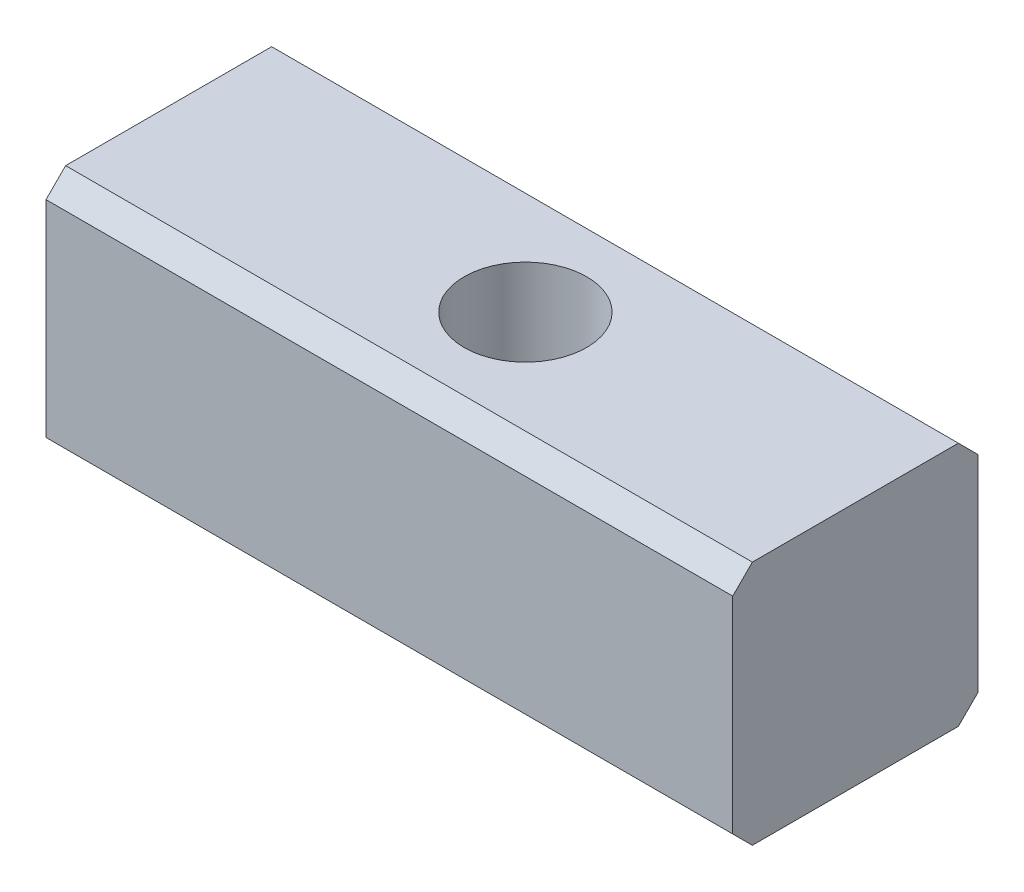
ISO-10303-21;
HEADER;
FILE_DESCRIPTION(('STEP AP214'),'2;1');
FILE_NAME('part.step','',(''),(''),'','','');
FILE_SCHEMA(('AUTOMOTIVE_DESIGN { 1 0 10303 214 1 1 1 1 }'));
ENDSEC;
DATA;
#1=APPLICATION_CONTEXT('core data for automotive mechanical design processes');
#2=APPLICATION_PROTOCOL_DEFINITION('international standard','automotive_design',2000,#1);
#3=PRODUCT_CONTEXT('',#1,'mechanical');
#4=PRODUCT('Part','Part','',(#3));
#5=PRODUCT_RELATED_PRODUCT_CATEGORY('part','',(#4));
#6=PRODUCT_DEFINITION_FORMATION('','',#4);
#7=PRODUCT_DEFINITION_CONTEXT('part definition',#1,'design');
#8=PRODUCT_DEFINITION('design','',#6,#7);
#9=PRODUCT_DEFINITION_SHAPE('','',#8);
#10=(LENGTH_UNIT() NAMED_UNIT(*) SI_UNIT(.MILLI.,.METRE.));
#11=(NAMED_UNIT(*) PLANE_ANGLE_UNIT() SI_UNIT($,.RADIAN.));
#12=(NAMED_UNIT(*) SI_UNIT($,.STERADIAN.) SOLID_ANGLE_UNIT());
#13=UNCERTAINTY_MEASURE_WITH_UNIT(LENGTH_MEASURE(1.E-05),#10,'distance_accuracy_value','');
#14=(GEOMETRIC_REPRESENTATION_CONTEXT(3) GLOBAL_UNCERTAINTY_ASSIGNED_CONTEXT((#13)) GLOBAL_UNIT_ASSIGNED_CONTEXT((#10,
#11,#12)) REPRESENTATION_CONTEXT('',''));
#15=CARTESIAN_POINT('',(0.,0.,0.));
#16=DIRECTION('',(0.,0.,1.));
#17=DIRECTION('',(1.,0.,0.));
#18=AXIS2_PLACEMENT_3D('',#15,#16,#17);
#19=CARTESIAN_POINT('',(7.27296482289966,2.50000000000001,0.));
#20=DIRECTION('',(0.,1.,0.));
#21=DIRECTION('',(0.,0.,1.));
#22=AXIS2_PLACEMENT_3D('',#19,#20,#21);
#23=CYLINDRICAL_SURFACE('',#22,1.24999999999999);
#24=CARTESIAN_POINT('',(7.27296482289966,2.50000000000001,0.));
#25=DIRECTION('',(0.,1.,0.));
#26=DIRECTION('',(0.,0.,1.));
#27=AXIS2_PLACEMENT_3D('',#24,#25,#26);
#28=CIRCLE('',#27,1.24999999999999);
#29=CARTESIAN_POINT('',(7.27296482289966,2.50000000000001,1.24999999999999));
#30=VERTEX_POINT('',#29);
#31=EDGE_CURVE('E20',#30,#30,#28,.T.);
#32=ORIENTED_EDGE('',*,*,#31,.T.);
#33=EDGE_LOOP('',(#32));
#34=FACE_BOUND('',#33,.T.);
#35=CARTESIAN_POINT('',(7.27296482289966,-2.50000000000001,0.));
#36=DIRECTION('',(0.,1.,0.));
#37=DIRECTION('',(0.,0.,1.));
#38=AXIS2_PLACEMENT_3D('',#35,#36,#37);
#39=CIRCLE('',#38,1.24999999999999);
#40=CARTESIAN_POINT('',(7.27296482289966,-2.50000000000001,1.24999999999999));
#41=VERTEX_POINT('',#40);
#42=EDGE_CURVE('E118',#41,#41,#39,.T.);
#43=ORIENTED_EDGE('',*,*,#42,.F.);
#44=EDGE_LOOP('',(#43));
#45=FACE_BOUND('',#44,.T.);
#46=ADVANCED_FACE('F17',(#34,#45),#23,.F.);
#47=CARTESIAN_POINT('',(0.,2.50000000000001,2.1));
#48=DIRECTION('',(0.,-0.707106781186546,-0.707106781186549));
#49=DIRECTION('',(0.,0.707106781186549,-0.707106781186546));
#50=AXIS2_PLACEMENT_3D('',#47,#48,#49);
#51=PLANE('',#50);
#52=DIRECTION('',(-1.,0.,0.));
#53=VECTOR('',#52,1.);
#54=CARTESIAN_POINT('',(0.,2.1,2.5));
#55=LINE('',#54,#53);
#56=CARTESIAN_POINT('',(0.,2.1,2.50000000000001));
#57=VERTEX_POINT('',#56);
#58=CARTESIAN_POINT('',(14.,2.1,2.50000000000001));
#59=VERTEX_POINT('',#58);
#60=EDGE_CURVE('E112',#57,#59,#55,.F.);
#61=ORIENTED_EDGE('',*,*,#60,.T.);
#62=DIRECTION('',(0.,0.707106781186549,-0.707106781186546));
#63=VECTOR('',#62,1.);
#64=CARTESIAN_POINT('',(14.,2.50000000000001,2.1));
#65=LINE('',#64,#63);
#66=CARTESIAN_POINT('',(14.,2.50000000000001,2.1));
#67=VERTEX_POINT('',#66);
#68=EDGE_CURVE('E126',#67,#59,#65,.F.);
#69=ORIENTED_EDGE('',*,*,#68,.F.);
#70=DIRECTION('',(1.,0.,0.));
#71=VECTOR('',#70,1.);
#72=CARTESIAN_POINT('',(0.,2.50000000000001,2.1));
#73=LINE('',#72,#71);
#74=CARTESIAN_POINT('',(0.,2.50000000000001,2.1));
#75=VERTEX_POINT('',#74);
#76=EDGE_CURVE('E119',#67,#75,#73,.F.);
#77=ORIENTED_EDGE('',*,*,#76,.T.);
#78=DIRECTION('',(0.,0.707106781186549,-0.707106781186546));
#79=VECTOR('',#78,1.);
#80=CARTESIAN_POINT('',(0.,2.50000000000001,2.1));
#81=LINE('',#80,#79);
#82=EDGE_CURVE('E79',#57,#75,#81,.T.);
#83=ORIENTED_EDGE('',*,*,#82,.F.);
#84=EDGE_LOOP('',(#61,#69,#77,#83));
#85=FACE_BOUND('',#84,.T.);
#86=ADVANCED_FACE('F133',(#85),#51,.F.);
#87=CARTESIAN_POINT('',(0.,-2.10000000000001,2.50000000000001));
#88=DIRECTION('',(0.,-0.70710678118655,0.707106781186546));
#89=DIRECTION('',(0.,-0.707106781186546,-0.70710678118655));
#90=AXIS2_PLACEMENT_3D('',#87,#88,#89);
#91=PLANE('',#90);
#92=DIRECTION('',(0.,-0.707106781186546,-0.70710678118655));
#93=VECTOR('',#92,1.);
#94=CARTESIAN_POINT('',(14.,-2.10000000000001,2.50000000000001));
#95=LINE('',#94,#93);
#96=CARTESIAN_POINT('',(14.,-2.50000000000001,2.10000000000001));
#97=VERTEX_POINT('',#96);
#98=CARTESIAN_POINT('',(14.,-2.10000000000001,2.50000000000001));
#99=VERTEX_POINT('',#98);
#100=EDGE_CURVE('E121',#97,#99,#95,.F.);
#101=ORIENTED_EDGE('',*,*,#100,.T.);
#102=DIRECTION('',(-1.,0.,0.));
#103=VECTOR('',#102,1.);
#104=CARTESIAN_POINT('',(0.,-2.10000000000001,2.5));
#105=LINE('',#104,#103);
#106=CARTESIAN_POINT('',(0.,-2.1,2.50000000000001));
#107=VERTEX_POINT('',#106);
#108=EDGE_CURVE('E97',#99,#107,#105,.T.);
#109=ORIENTED_EDGE('',*,*,#108,.T.);
#110=DIRECTION('',(0.,-0.707106781186546,-0.70710678118655));
#111=VECTOR('',#110,1.);
#112=CARTESIAN_POINT('',(0.,-2.10000000000001,2.50000000000001));
#113=LINE('',#112,#111);
#114=CARTESIAN_POINT('',(0.,-2.50000000000001,2.10000000000001));
#115=VERTEX_POINT('',#114);
#116=EDGE_CURVE('E123',#107,#115,#113,.T.);
#117=ORIENTED_EDGE('',*,*,#116,.T.);
#118=DIRECTION('',(1.,0.,0.));
#119=VECTOR('',#118,1.);
#120=CARTESIAN_POINT('',(0.,-2.50000000000001,2.10000000000001));
#121=LINE('',#120,#119);
#122=EDGE_CURVE('E115',#97,#115,#121,.F.);
#123=ORIENTED_EDGE('',*,*,#122,.F.);
#124=EDGE_LOOP('',(#101,#109,#117,#123));
#125=FACE_BOUND('',#124,.T.);
#126=ADVANCED_FACE('F139',(#125),#91,.T.);
#127=CARTESIAN_POINT('',(0.,2.50000000000001,0.));
#128=DIRECTION('',(0.,-1.,0.));
#129=DIRECTION('',(1.,0.,0.));
#130=AXIS2_PLACEMENT_3D('',#127,#128,#129);
#131=PLANE('',#130);
#132=DIRECTION('',(1.,0.,0.));
#133=VECTOR('',#132,1.);
#134=CARTESIAN_POINT('',(0.,2.50000000000001,-2.1));
#135=LINE('',#134,#133);
#136=CARTESIAN_POINT('',(14.,2.50000000000001,-2.1));
#137=VERTEX_POINT('',#136);
#138=CARTESIAN_POINT('',(0.,2.50000000000001,-2.1));
#139=VERTEX_POINT('',#138);
#140=EDGE_CURVE('E85',#137,#139,#135,.F.);
#141=ORIENTED_EDGE('',*,*,#140,.T.);
#142=DIRECTION('',(0.,0.,1.));
#143=VECTOR('',#142,1.);
#144=CARTESIAN_POINT('',(0.,2.50000000000001,-2.5));
#145=LINE('',#144,#143);
#146=EDGE_CURVE('E89',#139,#75,#145,.T.);
#147=ORIENTED_EDGE('',*,*,#146,.T.);
#148=ORIENTED_EDGE('',*,*,#76,.F.);
#149=DIRECTION('',(0.,0.,1.));
#150=VECTOR('',#149,1.);
#151=CARTESIAN_POINT('',(14.,2.50000000000001,-2.5));
#152=LINE('',#151,#150);
#153=EDGE_CURVE('E91',#67,#137,#152,.F.);
#154=ORIENTED_EDGE('',*,*,#153,.T.);
#155=EDGE_LOOP('',(#141,#147,#148,#154));
#156=FACE_BOUND('',#155,.T.);
#157=ORIENTED_EDGE('',*,*,#31,.F.);
#158=EDGE_LOOP('',(#157));
#159=FACE_BOUND('',#158,.T.);
#160=ADVANCED_FACE('F86',(#156,#159),#131,.F.);
#161=CARTESIAN_POINT('',(0.,-2.50000000000001,0.));
#162=DIRECTION('',(0.,-1.,0.));
#163=DIRECTION('',(1.,0.,0.));
#164=AXIS2_PLACEMENT_3D('',#161,#162,#163);
#165=PLANE('',#164);
#166=DIRECTION('',(0.,0.,1.));
#167=VECTOR('',#166,1.);
#168=CARTESIAN_POINT('',(0.,-2.50000000000001,-2.5));
#169=LINE('',#168,#167);
#170=CARTESIAN_POINT('',(0.,-2.50000000000001,-2.09999999999999));
#171=VERTEX_POINT('',#170);
#172=EDGE_CURVE('E197',#115,#171,#169,.F.);
#173=ORIENTED_EDGE('',*,*,#172,.T.);
#174=DIRECTION('',(1.,0.,0.));
#175=VECTOR('',#174,1.);
#176=CARTESIAN_POINT('',(0.,-2.50000000000001,-2.09999999999999));
#177=LINE('',#176,#175);
#178=CARTESIAN_POINT('',(14.,-2.50000000000001,-2.09999999999999));
#179=VERTEX_POINT('',#178);
#180=EDGE_CURVE('E195',#179,#171,#177,.F.);
#181=ORIENTED_EDGE('',*,*,#180,.F.);
#182=DIRECTION('',(0.,0.,1.));
#183=VECTOR('',#182,1.);
#184=CARTESIAN_POINT('',(14.,-2.50000000000001,-2.5));
#185=LINE('',#184,#183);
#186=EDGE_CURVE('E182',#179,#97,#185,.T.);
#187=ORIENTED_EDGE('',*,*,#186,.T.);
#188=ORIENTED_EDGE('',*,*,#122,.T.);
#189=EDGE_LOOP('',(#173,#181,#187,#188));
#190=FACE_BOUND('',#189,.T.);
#191=ORIENTED_EDGE('',*,*,#42,.T.);
#192=EDGE_LOOP('',(#191));
#193=FACE_BOUND('',#192,.T.);
#194=ADVANCED_FACE('F130',(#190,#193),#165,.T.);
#195=CARTESIAN_POINT('',(0.,2.50000000000001,2.5));
#196=DIRECTION('',(0.,0.,-1.));
#197=DIRECTION('',(-1.,0.,0.));
#198=AXIS2_PLACEMENT_3D('',#195,#196,#197);
#199=PLANE('',#198);
#200=ORIENTED_EDGE('',*,*,#108,.F.);
#201=DIRECTION('',(0.,-1.,0.));
#202=VECTOR('',#201,1.);
#203=CARTESIAN_POINT('',(14.,2.50000000000001,2.50000000000001));
#204=LINE('',#203,#202);
#205=EDGE_CURVE('E181',#99,#59,#204,.F.);
#206=ORIENTED_EDGE('',*,*,#205,.T.);
#207=ORIENTED_EDGE('',*,*,#60,.F.);
#208=DIRECTION('',(0.,1.,0.));
#209=VECTOR('',#208,1.);
#210=CARTESIAN_POINT('',(0.,2.50000000000001,2.50000000000001));
#211=LINE('',#210,#209);
#212=EDGE_CURVE('E102',#57,#107,#211,.F.);
#213=ORIENTED_EDGE('',*,*,#212,.T.);
#214=EDGE_LOOP('',(#200,#206,#207,#213));
#215=FACE_BOUND('',#214,.T.);
#216=ADVANCED_FACE('F161',(#215),#199,.F.);
#217=CARTESIAN_POINT('',(0.,2.50000000000001,-2.1));
#218=DIRECTION('',(0.,-0.707106781186546,0.707106781186549));
#219=DIRECTION('',(0.,-0.707106781186549,-0.707106781186546));
#220=AXIS2_PLACEMENT_3D('',#217,#218,#219);
#221=PLANE('',#220);
#222=DIRECTION('',(1.,0.,0.));
#223=VECTOR('',#222,1.);
#224=CARTESIAN_POINT('',(0.,2.1,-2.5));
#225=LINE('',#224,#223);
#226=CARTESIAN_POINT('',(14.,2.1,-2.5));
#227=VERTEX_POINT('',#226);
#228=CARTESIAN_POINT('',(0.,2.1,-2.5));
#229=VERTEX_POINT('',#228);
#230=EDGE_CURVE('E106',#227,#229,#225,.F.);
#231=ORIENTED_EDGE('',*,*,#230,.T.);
#232=DIRECTION('',(0.,0.707106781186549,0.707106781186546));
#233=VECTOR('',#232,1.);
#234=CARTESIAN_POINT('',(0.,2.1,-2.5));
#235=LINE('',#234,#233);
#236=EDGE_CURVE('E96',#229,#139,#235,.T.);
#237=ORIENTED_EDGE('',*,*,#236,.T.);
#238=ORIENTED_EDGE('',*,*,#140,.F.);
#239=DIRECTION('',(0.,-0.707106781186549,-0.707106781186546));
#240=VECTOR('',#239,1.);
#241=CARTESIAN_POINT('',(14.,2.50000000000001,-2.1));
#242=LINE('',#241,#240);
#243=EDGE_CURVE('E190',#137,#227,#242,.T.);
#244=ORIENTED_EDGE('',*,*,#243,.T.);
#245=EDGE_LOOP('',(#231,#237,#238,#244));
#246=FACE_BOUND('',#245,.T.);
#247=ADVANCED_FACE('F105',(#246),#221,.F.);
#248=CARTESIAN_POINT('',(0.,2.50000000000001,-2.5));
#249=DIRECTION('',(1.,0.,0.));
#250=DIRECTION('',(0.,1.,0.));
#251=AXIS2_PLACEMENT_3D('',#248,#249,#250);
#252=PLANE('',#251);
#253=ORIENTED_EDGE('',*,*,#116,.F.);
#254=ORIENTED_EDGE('',*,*,#212,.F.);
#255=ORIENTED_EDGE('',*,*,#82,.T.);
#256=ORIENTED_EDGE('',*,*,#146,.F.);
#257=ORIENTED_EDGE('',*,*,#236,.F.);
#258=DIRECTION('',(0.,1.,0.));
#259=VECTOR('',#258,1.);
#260=CARTESIAN_POINT('',(0.,2.50000000000001,-2.5));
#261=LINE('',#260,#259);
#262=CARTESIAN_POINT('',(0.,-2.10000000000001,-2.5));
#263=VERTEX_POINT('',#262);
#264=EDGE_CURVE('E184',#229,#263,#261,.F.);
#265=ORIENTED_EDGE('',*,*,#264,.T.);
#266=DIRECTION('',(0.,0.707106781186546,-0.70710678118655));
#267=VECTOR('',#266,1.);
#268=CARTESIAN_POINT('',(0.,-2.10000000000001,-2.5));
#269=LINE('',#268,#267);
#270=EDGE_CURVE('E193',#171,#263,#269,.T.);
#271=ORIENTED_EDGE('',*,*,#270,.F.);
#272=ORIENTED_EDGE('',*,*,#172,.F.);
#273=EDGE_LOOP('',(#253,#254,#255,#256,#257,#265,#271,#272));
#274=FACE_BOUND('',#273,.T.);
#275=ADVANCED_FACE('F99',(#274),#252,.F.);
#276=CARTESIAN_POINT('',(0.,-2.10000000000001,-2.5));
#277=DIRECTION('',(0.,-0.70710678118655,-0.707106781186546));
#278=DIRECTION('',(0.,0.707106781186546,-0.70710678118655));
#279=AXIS2_PLACEMENT_3D('',#276,#277,#278);
#280=PLANE('',#279);
#281=ORIENTED_EDGE('',*,*,#270,.T.);
#282=DIRECTION('',(1.,0.,0.));
#283=VECTOR('',#282,1.);
#284=CARTESIAN_POINT('',(0.,-2.10000000000001,-2.5));
#285=LINE('',#284,#283);
#286=CARTESIAN_POINT('',(14.,-2.10000000000001,-2.5));
#287=VERTEX_POINT('',#286);
#288=EDGE_CURVE('E26',#263,#287,#285,.T.);
#289=ORIENTED_EDGE('',*,*,#288,.T.);
#290=DIRECTION('',(0.,-0.707106781186544,0.707106781186551));
#291=VECTOR('',#290,1.);
#292=CARTESIAN_POINT('',(14.,-2.10000000000001,-2.5));
#293=LINE('',#292,#291);
#294=EDGE_CURVE('E34',#287,#179,#293,.T.);
#295=ORIENTED_EDGE('',*,*,#294,.T.);
#296=ORIENTED_EDGE('',*,*,#180,.T.);
#297=EDGE_LOOP('',(#281,#289,#295,#296));
#298=FACE_BOUND('',#297,.T.);
#299=ADVANCED_FACE('F150',(#298),#280,.T.);
#300=CARTESIAN_POINT('',(14.,2.50000000000001,-2.5));
#301=DIRECTION('',(-1.,0.,0.));
#302=DIRECTION('',(0.,-1.,0.));
#303=AXIS2_PLACEMENT_3D('',#300,#301,#302);
#304=PLANE('',#303);
#305=ORIENTED_EDGE('',*,*,#100,.F.);
#306=ORIENTED_EDGE('',*,*,#186,.F.);
#307=ORIENTED_EDGE('',*,*,#294,.F.);
#308=DIRECTION('',(0.,1.,0.));
#309=VECTOR('',#308,1.);
#310=CARTESIAN_POINT('',(14.,2.50000000000001,-2.5));
#311=LINE('',#310,#309);
#312=EDGE_CURVE('E11',#287,#227,#311,.T.);
#313=ORIENTED_EDGE('',*,*,#312,.T.);
#314=ORIENTED_EDGE('',*,*,#243,.F.);
#315=ORIENTED_EDGE('',*,*,#153,.F.);
#316=ORIENTED_EDGE('',*,*,#68,.T.);
#317=ORIENTED_EDGE('',*,*,#205,.F.);
#318=EDGE_LOOP('',(#305,#306,#307,#313,#314,#315,#316,#317));
#319=FACE_BOUND('',#318,.T.);
#320=ADVANCED_FACE('F144',(#319),#304,.F.);
#321=CARTESIAN_POINT('',(0.,2.50000000000001,-2.5));
#322=DIRECTION('',(0.,0.,1.));
#323=DIRECTION('',(1.,0.,0.));
#324=AXIS2_PLACEMENT_3D('',#321,#322,#323);
#325=PLANE('',#324);
#326=ORIENTED_EDGE('',*,*,#288,.F.);
#327=ORIENTED_EDGE('',*,*,#264,.F.);
#328=ORIENTED_EDGE('',*,*,#230,.F.);
#329=ORIENTED_EDGE('',*,*,#312,.F.);
#330=EDGE_LOOP('',(#326,#327,#328,#329));
#331=FACE_BOUND('',#330,.T.);
#332=ADVANCED_FACE('F142',(#331),#325,.F.);
#333=CLOSED_SHELL('',(#46,#86,#126,#160,#194,#216,#247,#275,#299,#320,#332));
#334=MANIFOLD_SOLID_BREP('B1',#333);
#335=ADVANCED_BREP_SHAPE_REPRESENTATION('',(#18,#334),#14);
#336=SHAPE_DEFINITION_REPRESENTATION(#9,#335);
ENDSEC;
END-ISO-10303-21;
